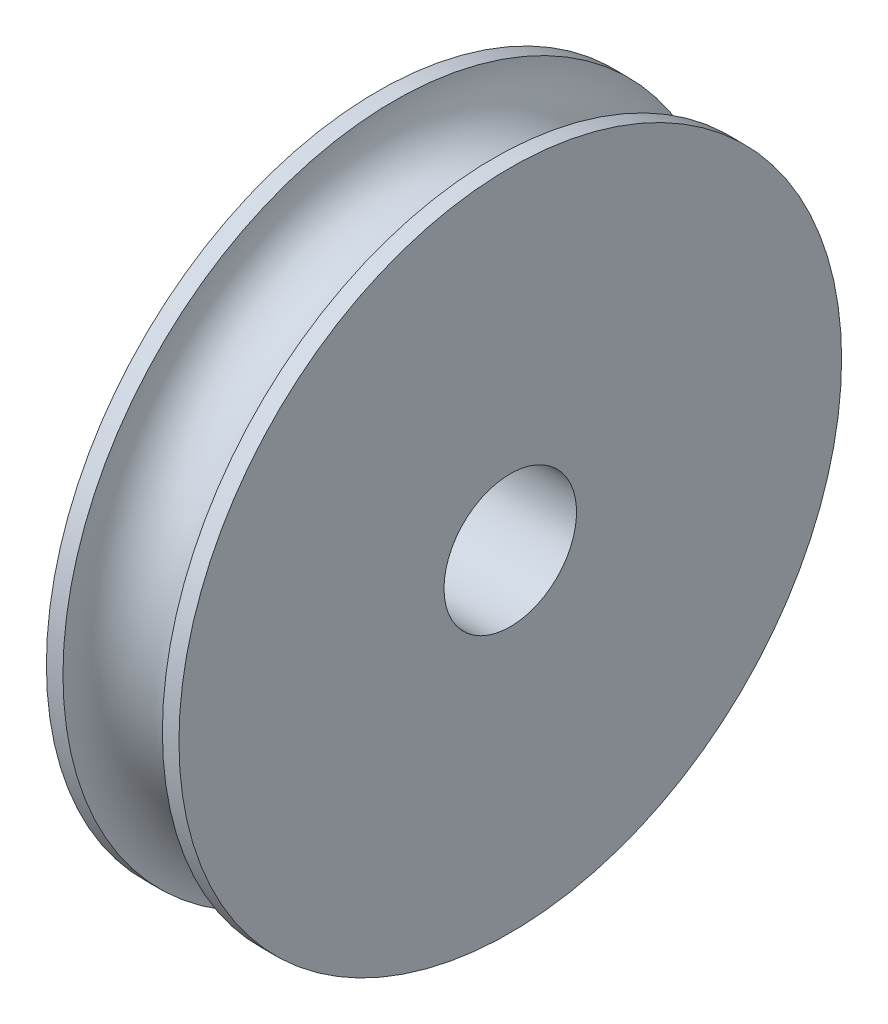
ISO-10303-21;
HEADER;
FILE_DESCRIPTION(('STEP AP214'),'2;1');
FILE_NAME('part.step','',(''),(''),'','','');
FILE_SCHEMA(('AUTOMOTIVE_DESIGN { 1 0 10303 214 1 1 1 1 }'));
ENDSEC;
DATA;
#1=APPLICATION_CONTEXT('core data for automotive mechanical design processes');
#2=APPLICATION_PROTOCOL_DEFINITION('international standard','automotive_design',2000,#1);
#3=PRODUCT_CONTEXT('',#1,'mechanical');
#4=PRODUCT('Part','Part','',(#3));
#5=PRODUCT_RELATED_PRODUCT_CATEGORY('part','',(#4));
#6=PRODUCT_DEFINITION_FORMATION('','',#4);
#7=PRODUCT_DEFINITION_CONTEXT('part definition',#1,'design');
#8=PRODUCT_DEFINITION('design','',#6,#7);
#9=PRODUCT_DEFINITION_SHAPE('','',#8);
#10=(LENGTH_UNIT() NAMED_UNIT(*) SI_UNIT(.MILLI.,.METRE.));
#11=(NAMED_UNIT(*) PLANE_ANGLE_UNIT() SI_UNIT($,.RADIAN.));
#12=(NAMED_UNIT(*) SI_UNIT($,.STERADIAN.) SOLID_ANGLE_UNIT());
#13=UNCERTAINTY_MEASURE_WITH_UNIT(LENGTH_MEASURE(1.E-05),#10,'distance_accuracy_value','');
#14=(GEOMETRIC_REPRESENTATION_CONTEXT(3) GLOBAL_UNCERTAINTY_ASSIGNED_CONTEXT((#13)) GLOBAL_UNIT_ASSIGNED_CONTEXT((#10,
#11,#12)) REPRESENTATION_CONTEXT('',''));
#15=CARTESIAN_POINT('',(0.,0.,0.));
#16=DIRECTION('',(0.,0.,1.));
#17=DIRECTION('',(1.,0.,0.));
#18=AXIS2_PLACEMENT_3D('',#15,#16,#17);
#19=CARTESIAN_POINT('',(8.,0.,0.));
#20=DIRECTION('',(-1.,0.,0.));
#21=DIRECTION('',(0.,0.,1.));
#22=AXIS2_PLACEMENT_3D('',#19,#20,#21);
#23=PLANE('',#22);
#24=CARTESIAN_POINT('',(8.,0.,0.));
#25=DIRECTION('',(-1.,0.,0.));
#26=DIRECTION('',(0.,0.,1.));
#27=AXIS2_PLACEMENT_3D('',#24,#25,#26);
#28=CIRCLE('',#27,4.);
#29=CARTESIAN_POINT('',(8.,0.,4.));
#30=VERTEX_POINT('',#29);
#31=EDGE_CURVE('E52',#30,#30,#28,.T.);
#32=ORIENTED_EDGE('',*,*,#31,.T.);
#33=EDGE_LOOP('',(#32));
#34=FACE_BOUND('',#33,.T.);
#35=CARTESIAN_POINT('',(8.,0.,0.));
#36=DIRECTION('',(-1.,0.,0.));
#37=DIRECTION('',(0.,0.,1.));
#38=AXIS2_PLACEMENT_3D('',#35,#36,#37);
#39=CIRCLE('',#38,20.);
#40=CARTESIAN_POINT('',(8.,0.,20.));
#41=VERTEX_POINT('',#40);
#42=EDGE_CURVE('E10',#41,#41,#39,.T.);
#43=ORIENTED_EDGE('',*,*,#42,.F.);
#44=EDGE_LOOP('',(#43));
#45=FACE_BOUND('',#44,.T.);
#46=ADVANCED_FACE('F33',(#34,#45),#23,.F.);
#47=CARTESIAN_POINT('',(0.,0.,0.));
#48=DIRECTION('',(-1.,0.,0.));
#49=DIRECTION('',(0.,0.,1.));
#50=AXIS2_PLACEMENT_3D('',#47,#48,#49);
#51=CYLINDRICAL_SURFACE('',#50,20.);
#52=CARTESIAN_POINT('',(7.,0.,0.));
#53=DIRECTION('',(-1.,0.,0.));
#54=DIRECTION('',(0.,0.,1.));
#55=AXIS2_PLACEMENT_3D('',#52,#53,#54);
#56=CIRCLE('',#55,20.);
#57=CARTESIAN_POINT('',(7.,0.,20.));
#58=VERTEX_POINT('',#57);
#59=EDGE_CURVE('E39',#58,#58,#56,.T.);
#60=ORIENTED_EDGE('',*,*,#59,.F.);
#61=EDGE_LOOP('',(#60));
#62=FACE_BOUND('',#61,.T.);
#63=ORIENTED_EDGE('',*,*,#42,.T.);
#64=EDGE_LOOP('',(#63));
#65=FACE_BOUND('',#64,.T.);
#66=ADVANCED_FACE('F76',(#62,#65),#51,.T.);
#67=CARTESIAN_POINT('',(4.,0.,0.));
#68=DIRECTION('',(-1.,0.,0.));
#69=DIRECTION('',(0.,0.,1.));
#70=AXIS2_PLACEMENT_3D('',#67,#68,#69);
#71=TOROIDAL_SURFACE('',#70,20.,3.);
#72=CARTESIAN_POINT('',(1.,0.,0.));
#73=DIRECTION('',(-1.,0.,0.));
#74=DIRECTION('',(0.,0.,1.));
#75=AXIS2_PLACEMENT_3D('',#72,#73,#74);
#76=CIRCLE('',#75,20.);
#77=CARTESIAN_POINT('',(1.,0.,20.));
#78=VERTEX_POINT('',#77);
#79=EDGE_CURVE('E43',#78,#78,#76,.T.);
#80=ORIENTED_EDGE('',*,*,#79,.F.);
#81=EDGE_LOOP('',(#80));
#82=FACE_BOUND('',#81,.T.);
#83=ORIENTED_EDGE('',*,*,#59,.T.);
#84=EDGE_LOOP('',(#83));
#85=FACE_BOUND('',#84,.T.);
#86=ADVANCED_FACE('F71',(#82,#85),#71,.F.);
#87=CARTESIAN_POINT('',(0.,0.,0.));
#88=DIRECTION('',(-1.,0.,0.));
#89=DIRECTION('',(0.,0.,1.));
#90=AXIS2_PLACEMENT_3D('',#87,#88,#89);
#91=CYLINDRICAL_SURFACE('',#90,20.);
#92=CARTESIAN_POINT('',(0.,0.,0.));
#93=DIRECTION('',(-1.,0.,0.));
#94=DIRECTION('',(0.,0.,1.));
#95=AXIS2_PLACEMENT_3D('',#92,#93,#94);
#96=CIRCLE('',#95,20.);
#97=CARTESIAN_POINT('',(0.,0.,20.));
#98=VERTEX_POINT('',#97);
#99=EDGE_CURVE('E47',#98,#98,#96,.T.);
#100=ORIENTED_EDGE('',*,*,#99,.F.);
#101=EDGE_LOOP('',(#100));
#102=FACE_BOUND('',#101,.T.);
#103=ORIENTED_EDGE('',*,*,#79,.T.);
#104=EDGE_LOOP('',(#103));
#105=FACE_BOUND('',#104,.T.);
#106=ADVANCED_FACE('F65',(#102,#105),#91,.T.);
#107=CARTESIAN_POINT('',(0.,0.,0.));
#108=DIRECTION('',(1.,0.,0.));
#109=DIRECTION('',(0.,0.,-1.));
#110=AXIS2_PLACEMENT_3D('',#107,#108,#109);
#111=PLANE('',#110);
#112=CARTESIAN_POINT('',(0.,0.,0.));
#113=DIRECTION('',(-1.,0.,0.));
#114=DIRECTION('',(0.,0.,1.));
#115=AXIS2_PLACEMENT_3D('',#112,#113,#114);
#116=CIRCLE('',#115,4.);
#117=CARTESIAN_POINT('',(0.,0.,4.));
#118=VERTEX_POINT('',#117);
#119=EDGE_CURVE('E55',#118,#118,#116,.T.);
#120=ORIENTED_EDGE('',*,*,#119,.F.);
#121=EDGE_LOOP('',(#120));
#122=FACE_BOUND('',#121,.T.);
#123=ORIENTED_EDGE('',*,*,#99,.T.);
#124=EDGE_LOOP('',(#123));
#125=FACE_BOUND('',#124,.T.);
#126=ADVANCED_FACE('F62',(#122,#125),#111,.F.);
#127=CARTESIAN_POINT('',(10.,0.,0.));
#128=DIRECTION('',(-1.,0.,0.));
#129=DIRECTION('',(0.,0.,1.));
#130=AXIS2_PLACEMENT_3D('',#127,#128,#129);
#131=CYLINDRICAL_SURFACE('',#130,4.);
#132=ORIENTED_EDGE('',*,*,#119,.T.);
#133=EDGE_LOOP('',(#132));
#134=FACE_BOUND('',#133,.T.);
#135=ORIENTED_EDGE('',*,*,#31,.F.);
#136=EDGE_LOOP('',(#135));
#137=FACE_BOUND('',#136,.T.);
#138=ADVANCED_FACE('F59',(#134,#137),#131,.F.);
#139=CLOSED_SHELL('',(#46,#66,#86,#106,#126,#138));
#140=MANIFOLD_SOLID_BREP('B2',#139);
#141=ADVANCED_BREP_SHAPE_REPRESENTATION('',(#18,#140),#14);
#142=SHAPE_DEFINITION_REPRESENTATION(#9,#141);
ENDSEC;
END-ISO-10303-21;
